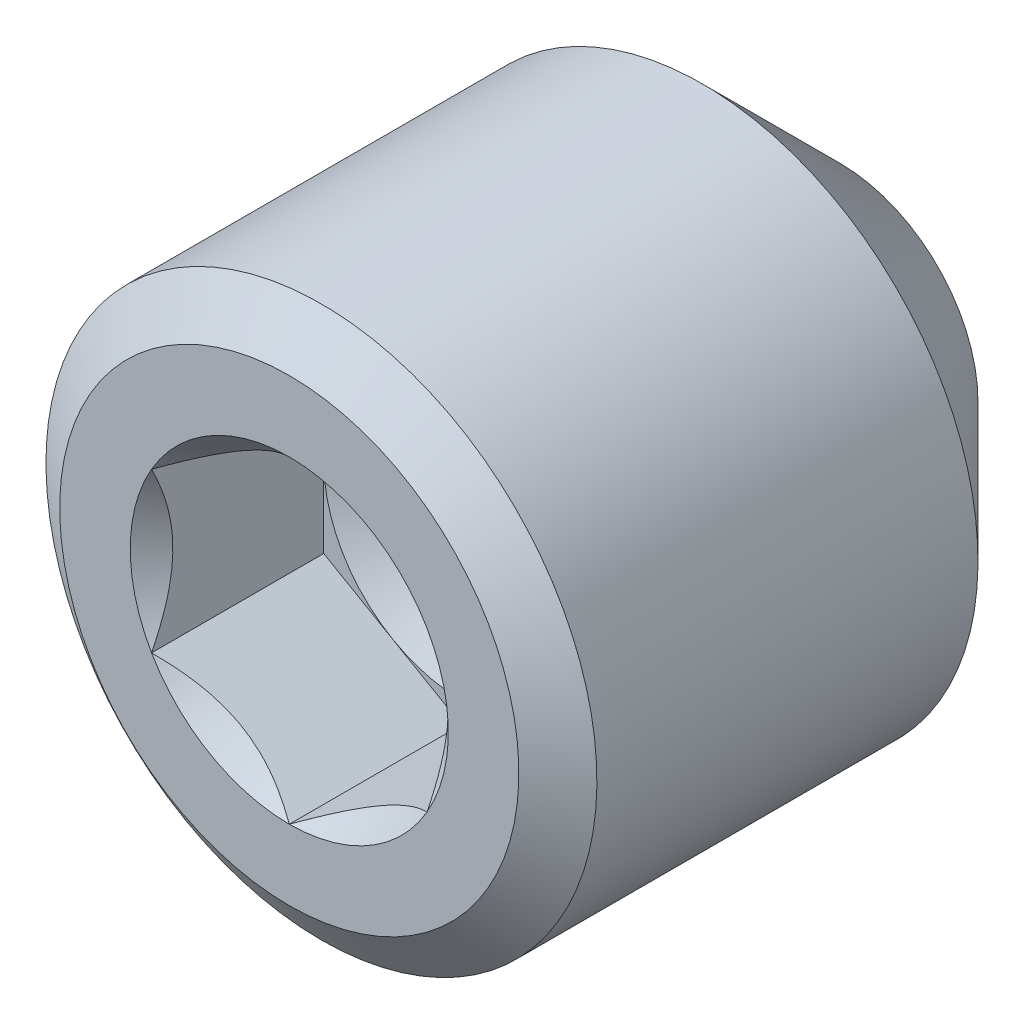
ISO-10303-21;
HEADER;
FILE_DESCRIPTION(('STEP AP214'),'2;1');
FILE_NAME('part.step','',(''),(''),'','','');
FILE_SCHEMA(('AUTOMOTIVE_DESIGN { 1 0 10303 214 1 1 1 1 }'));
ENDSEC;
DATA;
#1=APPLICATION_CONTEXT('core data for automotive mechanical design processes');
#2=APPLICATION_PROTOCOL_DEFINITION('international standard','automotive_design',2000,#1);
#3=PRODUCT_CONTEXT('',#1,'mechanical');
#4=PRODUCT('Part','Part','',(#3));
#5=PRODUCT_RELATED_PRODUCT_CATEGORY('part','',(#4));
#6=PRODUCT_DEFINITION_FORMATION('','',#4);
#7=PRODUCT_DEFINITION_CONTEXT('part definition',#1,'design');
#8=PRODUCT_DEFINITION('design','',#6,#7);
#9=PRODUCT_DEFINITION_SHAPE('','',#8);
#10=(LENGTH_UNIT() NAMED_UNIT(*) SI_UNIT(.MILLI.,.METRE.));
#11=(NAMED_UNIT(*) PLANE_ANGLE_UNIT() SI_UNIT($,.RADIAN.));
#12=(NAMED_UNIT(*) SI_UNIT($,.STERADIAN.) SOLID_ANGLE_UNIT());
#13=UNCERTAINTY_MEASURE_WITH_UNIT(LENGTH_MEASURE(1.E-05),#10,'distance_accuracy_value','');
#14=(GEOMETRIC_REPRESENTATION_CONTEXT(3) GLOBAL_UNCERTAINTY_ASSIGNED_CONTEXT((#13)) GLOBAL_UNIT_ASSIGNED_CONTEXT((#10,
#11,#12)) REPRESENTATION_CONTEXT('',''));
#15=CARTESIAN_POINT('',(0.,0.,0.));
#16=DIRECTION('',(0.,0.,1.));
#17=DIRECTION('',(1.,0.,0.));
#18=AXIS2_PLACEMENT_3D('',#15,#16,#17);
#19=CARTESIAN_POINT('',(-0.75,1.29903810567666,0.5625));
#20=DIRECTION('',(0.,0.,1.));
#21=DIRECTION('',(1.,0.,0.));
#22=AXIS2_PLACEMENT_3D('',#19,#20,#21);
#23=PLANE('',#22);
#24=CARTESIAN_POINT('',(0.,0.,0.5625));
#25=DIRECTION('',(0.,0.,1.));
#26=DIRECTION('',(1.,0.,0.));
#27=AXIS2_PLACEMENT_3D('',#24,#25,#26);
#28=CIRCLE('',#27,0.75);
#29=CARTESIAN_POINT('',(0.75,0.,0.5625));
#30=VERTEX_POINT('',#29);
#31=CARTESIAN_POINT('',(0.374999999999995,0.649519052838332,0.5625));
#32=VERTEX_POINT('',#31);
#33=EDGE_CURVE('E131',#30,#32,#28,.T.);
#34=ORIENTED_EDGE('',*,*,#33,.F.);
#35=DIRECTION('',(0.,1.,0.));
#36=VECTOR('',#35,1.);
#37=CARTESIAN_POINT('',(0.75,-0.433012701892219,0.5625));
#38=LINE('',#37,#36);
#39=CARTESIAN_POINT('',(0.75,0.433012701892219,0.5625));
#40=VERTEX_POINT('',#39);
#41=EDGE_CURVE('E160',#30,#40,#38,.T.);
#42=ORIENTED_EDGE('',*,*,#41,.T.);
#43=DIRECTION('',(-0.866025403784439,0.5,0.));
#44=VECTOR('',#43,1.);
#45=CARTESIAN_POINT('',(0.75,0.433012701892219,0.5625));
#46=LINE('',#45,#44);
#47=EDGE_CURVE('E154',#40,#32,#46,.T.);
#48=ORIENTED_EDGE('',*,*,#47,.T.);
#49=EDGE_LOOP('',(#34,#42,#48));
#50=FACE_BOUND('',#49,.T.);
#51=ADVANCED_FACE('F43',(#50),#23,.T.);
#52=CARTESIAN_POINT('',(-0.374999999999996,0.649519052838332,0.5625));
#53=VERTEX_POINT('',#52);
#54=EDGE_CURVE('E133',#32,#53,#28,.T.);
#55=ORIENTED_EDGE('',*,*,#54,.F.);
#56=CARTESIAN_POINT('',(0.,0.866025403784438,0.5625));
#57=VERTEX_POINT('',#56);
#58=EDGE_CURVE('E145',#32,#57,#46,.T.);
#59=ORIENTED_EDGE('',*,*,#58,.T.);
#60=DIRECTION('',(-0.866025403784438,-0.5,0.));
#61=VECTOR('',#60,1.);
#62=CARTESIAN_POINT('',(0.,0.866025403784438,0.5625));
#63=LINE('',#62,#61);
#64=EDGE_CURVE('E148',#57,#53,#63,.T.);
#65=ORIENTED_EDGE('',*,*,#64,.T.);
#66=EDGE_LOOP('',(#55,#59,#65));
#67=FACE_BOUND('',#66,.T.);
#68=ADVANCED_FACE('F144',(#67),#23,.T.);
#69=CARTESIAN_POINT('',(-0.75,0.,0.5625));
#70=VERTEX_POINT('',#69);
#71=EDGE_CURVE('E150',#53,#70,#28,.T.);
#72=ORIENTED_EDGE('',*,*,#71,.F.);
#73=CARTESIAN_POINT('',(-0.75,0.433012701892219,0.5625));
#74=VERTEX_POINT('',#73);
#75=EDGE_CURVE('E163',#53,#74,#63,.T.);
#76=ORIENTED_EDGE('',*,*,#75,.T.);
#77=DIRECTION('',(0.,-1.,0.));
#78=VECTOR('',#77,1.);
#79=CARTESIAN_POINT('',(-0.75,0.433012701892219,0.5625));
#80=LINE('',#79,#78);
#81=EDGE_CURVE('E176',#74,#70,#80,.T.);
#82=ORIENTED_EDGE('',*,*,#81,.T.);
#83=EDGE_LOOP('',(#72,#76,#82));
#84=FACE_BOUND('',#83,.T.);
#85=ADVANCED_FACE('F265',(#84),#23,.T.);
#86=CARTESIAN_POINT('',(-0.375000000000005,-0.649519052838327,0.5625));
#87=VERTEX_POINT('',#86);
#88=EDGE_CURVE('E292',#70,#87,#28,.T.);
#89=ORIENTED_EDGE('',*,*,#88,.F.);
#90=CARTESIAN_POINT('',(-0.75,-0.43301270189222,0.5625));
#91=VERTEX_POINT('',#90);
#92=EDGE_CURVE('E175',#70,#91,#80,.T.);
#93=ORIENTED_EDGE('',*,*,#92,.T.);
#94=DIRECTION('',(0.866025403784439,-0.5,0.));
#95=VECTOR('',#94,1.);
#96=CARTESIAN_POINT('',(-0.75,-0.43301270189222,0.5625));
#97=LINE('',#96,#95);
#98=EDGE_CURVE('E181',#91,#87,#97,.T.);
#99=ORIENTED_EDGE('',*,*,#98,.T.);
#100=EDGE_LOOP('',(#89,#93,#99));
#101=FACE_BOUND('',#100,.T.);
#102=ADVANCED_FACE('F280',(#101),#23,.T.);
#103=CARTESIAN_POINT('',(0.375000000000005,-0.649519052838326,0.5625));
#104=VERTEX_POINT('',#103);
#105=EDGE_CURVE('E65',#87,#104,#28,.T.);
#106=ORIENTED_EDGE('',*,*,#105,.F.);
#107=CARTESIAN_POINT('',(0.,-0.866025403784439,0.5625));
#108=VERTEX_POINT('',#107);
#109=EDGE_CURVE('E180',#87,#108,#97,.T.);
#110=ORIENTED_EDGE('',*,*,#109,.T.);
#111=DIRECTION('',(0.866025403784439,0.5,0.));
#112=VECTOR('',#111,1.);
#113=CARTESIAN_POINT('',(0.,-0.866025403784439,0.5625));
#114=LINE('',#113,#112);
#115=EDGE_CURVE('E186',#108,#104,#114,.T.);
#116=ORIENTED_EDGE('',*,*,#115,.T.);
#117=EDGE_LOOP('',(#106,#110,#116));
#118=FACE_BOUND('',#117,.T.);
#119=ADVANCED_FACE('F270',(#118),#23,.T.);
#120=CARTESIAN_POINT('',(0.,0.,1.5));
#121=DIRECTION('',(0.,0.,-1.));
#122=DIRECTION('',(0.,1.,0.));
#123=AXIS2_PLACEMENT_3D('',#120,#121,#122);
#124=PLANE('',#123);
#125=CARTESIAN_POINT('',(0.,0.,1.5));
#126=DIRECTION('',(0.,0.,1.));
#127=DIRECTION('',(1.,0.,0.));
#128=AXIS2_PLACEMENT_3D('',#125,#126,#127);
#129=CIRCLE('',#128,0.866025403784439);
#130=CARTESIAN_POINT('',(0.,0.866025403784438,1.5));
#131=VERTEX_POINT('',#130);
#132=CARTESIAN_POINT('',(-0.749999999999999,0.43301270189222,1.5));
#133=VERTEX_POINT('',#132);
#134=EDGE_CURVE('E321',#131,#133,#129,.T.);
#135=ORIENTED_EDGE('',*,*,#134,.F.);
#136=CARTESIAN_POINT('',(0.75,0.433012701892217,1.5));
#137=VERTEX_POINT('',#136);
#138=EDGE_CURVE('E322',#137,#131,#129,.T.);
#139=ORIENTED_EDGE('',*,*,#138,.F.);
#140=CARTESIAN_POINT('',(0.750000000000001,-0.433012701892219,1.5));
#141=VERTEX_POINT('',#140);
#142=EDGE_CURVE('E72',#141,#137,#129,.T.);
#143=ORIENTED_EDGE('',*,*,#142,.F.);
#144=CARTESIAN_POINT('',(0.,-0.86602540378444,1.5));
#145=VERTEX_POINT('',#144);
#146=EDGE_CURVE('E314',#145,#141,#129,.T.);
#147=ORIENTED_EDGE('',*,*,#146,.F.);
#148=CARTESIAN_POINT('',(-0.75,-0.433012701892221,1.5));
#149=VERTEX_POINT('',#148);
#150=EDGE_CURVE('E311',#149,#145,#129,.T.);
#151=ORIENTED_EDGE('',*,*,#150,.F.);
#152=EDGE_CURVE('E313',#133,#149,#129,.T.);
#153=ORIENTED_EDGE('',*,*,#152,.F.);
#154=EDGE_LOOP('',(#135,#139,#143,#147,#151,#153));
#155=FACE_BOUND('',#154,.T.);
#156=CARTESIAN_POINT('',(0.,0.,1.5));
#157=DIRECTION('',(0.,0.,1.));
#158=DIRECTION('',(0.,-1.,0.));
#159=AXIS2_PLACEMENT_3D('',#156,#157,#158);
#160=CIRCLE('',#159,1.25);
#161=CARTESIAN_POINT('',(0.,-1.25,1.5));
#162=VERTEX_POINT('',#161);
#163=EDGE_CURVE('E58',#162,#162,#160,.T.);
#164=ORIENTED_EDGE('',*,*,#163,.T.);
#165=EDGE_LOOP('',(#164));
#166=FACE_BOUND('',#165,.T.);
#167=ADVANCED_FACE('F45',(#155,#166),#124,.F.);
#168=CARTESIAN_POINT('',(0.,0.,1.32494811544757));
#169=DIRECTION('',(0.,0.,-1.));
#170=DIRECTION('',(0.,1.,0.));
#171=AXIS2_PLACEMENT_3D('',#168,#169,#170);
#172=CONICAL_SURFACE('',#171,1.5,0.959931088596878);
#173=ORIENTED_EDGE('',*,*,#163,.F.);
#174=EDGE_LOOP('',(#173));
#175=FACE_BOUND('',#174,.T.);
#176=CARTESIAN_POINT('',(0.,0.,1.32494811544757));
#177=DIRECTION('',(0.,0.,1.));
#178=DIRECTION('',(0.,-1.,0.));
#179=AXIS2_PLACEMENT_3D('',#176,#177,#178);
#180=CIRCLE('',#179,1.5);
#181=CARTESIAN_POINT('',(0.,-1.5,1.32494811544757));
#182=VERTEX_POINT('',#181);
#183=EDGE_CURVE('E223',#182,#182,#180,.T.);
#184=ORIENTED_EDGE('',*,*,#183,.T.);
#185=EDGE_LOOP('',(#184));
#186=FACE_BOUND('',#185,.T.);
#187=ADVANCED_FACE('F231',(#175,#186),#172,.T.);
#188=CARTESIAN_POINT('',(0.,0.,-1.04935453572933));
#189=DIRECTION('',(0.,0.,1.));
#190=DIRECTION('',(0.,-1.,0.));
#191=AXIS2_PLACEMENT_3D('',#188,#189,#190);
#192=CYLINDRICAL_SURFACE('',#191,1.5);
#193=ORIENTED_EDGE('',*,*,#183,.F.);
#194=EDGE_LOOP('',(#193));
#195=FACE_BOUND('',#194,.T.);
#196=CARTESIAN_POINT('',(0.,0.,-0.750000000000008));
#197=DIRECTION('',(0.,0.,1.));
#198=DIRECTION('',(0.,-1.,0.));
#199=AXIS2_PLACEMENT_3D('',#196,#197,#198);
#200=CIRCLE('',#199,1.5);
#201=CARTESIAN_POINT('',(0.,-1.5,-0.750000000000008));
#202=VERTEX_POINT('',#201);
#203=EDGE_CURVE('E219',#202,#202,#200,.T.);
#204=ORIENTED_EDGE('',*,*,#203,.T.);
#205=EDGE_LOOP('',(#204));
#206=FACE_BOUND('',#205,.T.);
#207=ADVANCED_FACE('F234',(#195,#206),#192,.T.);
#208=CARTESIAN_POINT('',(0.,0.,-1.5));
#209=DIRECTION('',(0.,0.,1.));
#210=DIRECTION('',(0.,-1.,0.));
#211=AXIS2_PLACEMENT_3D('',#208,#209,#210);
#212=CONICAL_SURFACE('',#211,0.75,0.785398163397454);
#213=ORIENTED_EDGE('',*,*,#203,.F.);
#214=EDGE_LOOP('',(#213));
#215=FACE_BOUND('',#214,.T.);
#216=CARTESIAN_POINT('',(0.,0.,-1.5));
#217=DIRECTION('',(0.,0.,1.));
#218=DIRECTION('',(0.,-1.,0.));
#219=AXIS2_PLACEMENT_3D('',#216,#217,#218);
#220=CIRCLE('',#219,0.75);
#221=CARTESIAN_POINT('',(0.,-0.75,-1.5));
#222=VERTEX_POINT('',#221);
#223=EDGE_CURVE('E197',#222,#222,#220,.T.);
#224=ORIENTED_EDGE('',*,*,#223,.T.);
#225=EDGE_LOOP('',(#224));
#226=FACE_BOUND('',#225,.T.);
#227=ADVANCED_FACE('F239',(#215,#226),#212,.T.);
#228=CARTESIAN_POINT('',(0.,0.,-1.04935453572933));
#229=DIRECTION('',(0.,0.,-1.));
#230=DIRECTION('',(0.,1.,0.));
#231=AXIS2_PLACEMENT_3D('',#228,#229,#230);
#232=CONICAL_SURFACE('',#231,0.,1.02974425867666);
#233=ORIENTED_EDGE('',*,*,#223,.F.);
#234=EDGE_LOOP('',(#233));
#235=FACE_BOUND('',#234,.T.);
#236=CARTESIAN_POINT('',(0.,0.,-1.04935453572933));
#237=VERTEX_POINT('',#236);
#238=VERTEX_LOOP('',#237);
#239=FACE_BOUND('',#238,.T.);
#240=ADVANCED_FACE('F245',(#235,#239),#232,.F.);
#241=CARTESIAN_POINT('',(0.,0.,1.5));
#242=DIRECTION('',(0.,0.,1.));
#243=DIRECTION('',(1.,0.,0.));
#244=AXIS2_PLACEMENT_3D('',#241,#242,#243);
#245=CONICAL_SURFACE('',#244,0.866025403784439,0.78539816339745);
#246=ORIENTED_EDGE('',*,*,#134,.T.);
#247=CARTESIAN_POINT('',(0.00019999999999911,0.866140873838276,1.50011549314477));
#248=CARTESIAN_POINT('',(-0.0255899625576824,0.851251032013209,1.48523411046393));
#249=CARTESIAN_POINT('',(-0.0518112021286601,0.836112192288419,1.47122626560696));
#250=CARTESIAN_POINT('',(-0.105279708235707,0.805242135894348,1.44557752468226));
#251=CARTESIAN_POINT('',(-0.132532067460574,0.789507978959819,1.43395091170567));
#252=CARTESIAN_POINT('',(-0.187485350381354,0.757780686272653,1.41403404577224));
#253=CARTESIAN_POINT('',(-0.215172256695511,0.741795643459147,1.40569369408137));
#254=CARTESIAN_POINT('',(-0.271155595130854,0.709473647943367,1.39284274196143));
#255=CARTESIAN_POINT('',(-0.299450314843646,0.693137683900541,1.38832254058884));
#256=CARTESIAN_POINT('',(-0.348210289268845,0.664986099540474,1.38424583309744));
#257=CARTESIAN_POINT('',(-0.368612065655574,0.653207128451649,1.38364279661408));
#258=CARTESIAN_POINT('',(-0.409376134696362,0.629671982217686,1.38465450601553));
#259=CARTESIAN_POINT('',(-0.429738417651457,0.617915812672246,1.38626974099004));
#260=CARTESIAN_POINT('',(-0.490534543086826,0.58281515328645,1.39433614697304));
#261=CARTESIAN_POINT('',(-0.530665854996101,0.559645329552697,1.40400893582772));
#262=CARTESIAN_POINT('',(-0.601110400354027,0.518974152327357,1.42735631797232));
#263=CARTESIAN_POINT('',(-0.631753572009088,0.501282308923484,1.43980855807225));
#264=CARTESIAN_POINT('',(-0.691839345804791,0.466591771248068,1.46785961023086));
#265=CARTESIAN_POINT('',(-0.721285488381591,0.449591032904756,1.48344818590375));
#266=CARTESIAN_POINT('',(-0.7502,0.432897231838381,1.50011549314477));
#267=B_SPLINE_CURVE_WITH_KNOTS('',3,(#247,#248,#249,#250,#251,#252,#253,#254,#255,#256,#257,
#258,#259,#260,#261,#262,#263,#264,#265,#266),.UNSPECIFIED.,.F.,.F.,(4,2,2,2,2,2,2,2,2,4),(0.,
0.0999419466095597,0.200466857654446,0.299393763705718,0.398071297300231,0.468665775681749,
0.53927582139884,0.680536257244568,0.792918418368074,0.904939568716031),.UNSPECIFIED.);
#268=EDGE_CURVE('E11',#131,#133,#267,.T.);
#269=ORIENTED_EDGE('',*,*,#268,.F.);
#270=EDGE_LOOP('',(#246,#269));
#271=FACE_BOUND('',#270,.T.);
#272=ADVANCED_FACE('F251',(#271),#245,.F.);
#273=ORIENTED_EDGE('',*,*,#152,.T.);
#274=CARTESIAN_POINT('',(-0.75,-0.863604064848461,1.77778925813539));
#275=CARTESIAN_POINT('',(-0.75,-0.842575879734331,1.76191493200841));
#276=CARTESIAN_POINT('',(-0.75,-0.821430496291559,1.746196265183));
#277=CARTESIAN_POINT('',(-0.75,-0.778857857419018,1.71513452062663));
#278=CARTESIAN_POINT('',(-0.75,-0.757430533042235,1.69979153749355));
#279=CARTESIAN_POINT('',(-0.75,-0.692340710712935,1.65420358029366));
#280=CARTESIAN_POINT('',(-0.75,-0.648190081053412,1.62464409174343));
#281=CARTESIAN_POINT('',(-0.75,-0.555607181501749,1.5666155826928));
#282=CARTESIAN_POINT('',(-0.75,-0.507074363017995,1.53830510936579));
#283=CARTESIAN_POINT('',(-0.75,-0.407587529772337,1.48651811176889));
#284=CARTESIAN_POINT('',(-0.75,-0.35664241954847,1.46302529153185));
#285=CARTESIAN_POINT('',(-0.75,-0.280165468820771,1.43428689950068));
#286=CARTESIAN_POINT('',(-0.75,-0.255770023930572,1.42603927481305));
#287=CARTESIAN_POINT('',(-0.75,-0.206403277885132,1.41149717542019));
#288=CARTESIAN_POINT('',(-0.75,-0.181431937185907,1.40520283526912));
#289=CARTESIAN_POINT('',(-0.75,-0.106699879404925,1.3899931738806));
#290=CARTESIAN_POINT('',(-0.75,-0.0561907171762178,1.38437718471289));
#291=CARTESIAN_POINT('',(-0.75,0.0430767231749056,1.38362825645435));
#292=CARTESIAN_POINT('',(-0.75,0.0918322434166278,1.38812345140561));
#293=CARTESIAN_POINT('',(-0.75,0.164112195698293,1.40133730744598));
#294=CARTESIAN_POINT('',(-0.75,0.188278676879436,1.40690144638208));
#295=CARTESIAN_POINT('',(-0.75,0.23609448012033,1.41992316614873));
#296=CARTESIAN_POINT('',(-0.75,0.25974384527304,1.42738058854766));
#297=CARTESIAN_POINT('',(-0.75,0.334198278463819,1.45366646946609));
#298=CARTESIAN_POINT('',(-0.75,0.383940060445494,1.47549033804844));
#299=CARTESIAN_POINT('',(-0.75,0.481089225076666,1.52401180410059));
#300=CARTESIAN_POINT('',(-0.75,0.528487417973016,1.55072691131035));
#301=CARTESIAN_POINT('',(-0.75,0.619071540465251,1.60584285115078));
#302=CARTESIAN_POINT('',(-0.75,0.662349745300239,1.63409394545219));
#303=CARTESIAN_POINT('',(-0.75,0.726111623216224,1.6777671470975));
#304=CARTESIAN_POINT('',(-0.75,0.74709041925528,1.6924788605167));
#305=CARTESIAN_POINT('',(-0.75,0.78876134150186,1.7222913841024));
#306=CARTESIAN_POINT('',(-0.75,0.809453544535619,1.73739208676303));
#307=CARTESIAN_POINT('',(-0.75,0.830026390097469,1.75265408930473));
#308=B_SPLINE_CURVE_WITH_KNOTS('',3,(#274,#275,#276,#277,#278,#279,#280,#281,#282,#283,#284,
#285,#286,#287,#288,#289,#290,#291,#292,#293,#294,#295,#296,#297,#298,#299,#300,#301,#302,#303,
#304,#305,#306,#307),.UNSPECIFIED.,.F.,.F.,(4,2,2,2,2,2,2,2,2,2,2,2,2,2,2,2,4),(0.,
0.0790398443124675,0.158099390497592,0.3174252086741,0.485845155681375,0.653685658303955,
0.730869805636063,0.808059268704006,0.959469653380777,1.10540290447489,1.17973203111653,
1.25405493988071,1.41653726506053,1.57961304287543,1.73458511695815,1.81145152932466,
1.8882969211581),.UNSPECIFIED.);
#309=EDGE_CURVE('E305',#133,#149,#308,.F.);
#310=ORIENTED_EDGE('',*,*,#309,.F.);
#311=EDGE_LOOP('',(#273,#310));
#312=FACE_BOUND('',#311,.T.);
#313=ADVANCED_FACE('F256',(#312),#245,.F.);
#314=ORIENTED_EDGE('',*,*,#150,.T.);
#315=CARTESIAN_POINT('',(-0.7502,-0.432897231838382,1.50011549314477));
#316=CARTESIAN_POINT('',(-0.724410037442319,-0.44778707366345,1.48523411046392));
#317=CARTESIAN_POINT('',(-0.698188797871341,-0.462925913388239,1.47122626560696));
#318=CARTESIAN_POINT('',(-0.644720291764294,-0.49379596978231,1.44557752468226));
#319=CARTESIAN_POINT('',(-0.617467932539427,-0.509530126716839,1.43395091170567));
#320=CARTESIAN_POINT('',(-0.562514649618647,-0.541257419404005,1.41403404577224));
#321=CARTESIAN_POINT('',(-0.53482774330449,-0.557242462217512,1.40569369408137));
#322=CARTESIAN_POINT('',(-0.478844404869146,-0.589564457733291,1.39284274196142));
#323=CARTESIAN_POINT('',(-0.450549685156354,-0.605900421776117,1.38832254058884));
#324=CARTESIAN_POINT('',(-0.401789710731156,-0.634052006136184,1.38424583309743));
#325=CARTESIAN_POINT('',(-0.381387934344426,-0.645830977225009,1.38364279661408));
#326=CARTESIAN_POINT('',(-0.340623865303639,-0.669366123458972,1.38465450601552));
#327=CARTESIAN_POINT('',(-0.320261582348544,-0.681122293004411,1.38626974099003));
#328=CARTESIAN_POINT('',(-0.259465456913175,-0.716222952390208,1.39433614697304));
#329=CARTESIAN_POINT('',(-0.2193341450039,-0.73939277612396,1.40400893582772));
#330=CARTESIAN_POINT('',(-0.148889599645974,-0.7800639533493,1.42735631797231));
#331=CARTESIAN_POINT('',(-0.118246427990913,-0.797755796753173,1.43980855807225));
#332=CARTESIAN_POINT('',(-0.0581606541952098,-0.83244633442859,1.46785961023086));
#333=CARTESIAN_POINT('',(-0.0287145116184089,-0.849447072771902,1.48344818590375));
#334=CARTESIAN_POINT('',(0.000200000000000292,-0.866140873838277,1.50011549314477));
#335=B_SPLINE_CURVE_WITH_KNOTS('',3,(#315,#316,#317,#318,#319,#320,#321,#322,#323,#324,#325,
#326,#327,#328,#329,#330,#331,#332,#333,#334),.UNSPECIFIED.,.F.,.F.,(4,2,2,2,2,2,2,2,2,4),(0.,
0.09994194660956,0.200466857654447,0.299393763705718,0.398071297300232,0.468665775681749,
0.539275821398841,0.680536257244567,0.792918418368075,0.904939568716032),.UNSPECIFIED.);
#336=EDGE_CURVE('E308',#149,#145,#335,.T.);
#337=ORIENTED_EDGE('',*,*,#336,.F.);
#338=EDGE_LOOP('',(#314,#337));
#339=FACE_BOUND('',#338,.T.);
#340=ADVANCED_FACE('F477',(#339),#245,.F.);
#341=ORIENTED_EDGE('',*,*,#146,.T.);
#342=CARTESIAN_POINT('',(-0.000199999999999794,-0.866140873838277,1.50011549314477));
#343=CARTESIAN_POINT('',(0.0255899625576816,-0.851251032013209,1.48523411046392));
#344=CARTESIAN_POINT('',(0.0518112021286594,-0.836112192288419,1.47122626560696));
#345=CARTESIAN_POINT('',(0.105279708235707,-0.805242135894348,1.44557752468226));
#346=CARTESIAN_POINT('',(0.132532067460573,-0.789507978959819,1.43395091170566));
#347=CARTESIAN_POINT('',(0.187485350381353,-0.757780686272653,1.41403404577224));
#348=CARTESIAN_POINT('',(0.21517225669551,-0.741795643459147,1.40569369408137));
#349=CARTESIAN_POINT('',(0.271155595130853,-0.709473647943368,1.39284274196142));
#350=CARTESIAN_POINT('',(0.299450314843645,-0.693137683900542,1.38832254058884));
#351=CARTESIAN_POINT('',(0.348210289268844,-0.664986099540475,1.38424583309743));
#352=CARTESIAN_POINT('',(0.368612065655573,-0.65320712845165,1.38364279661408));
#353=CARTESIAN_POINT('',(0.40937613469636,-0.629671982217687,1.38465450601552));
#354=CARTESIAN_POINT('',(0.429738417651455,-0.617915812672247,1.38626974099003));
#355=CARTESIAN_POINT('',(0.490534543086824,-0.582815153286451,1.39433614697304));
#356=CARTESIAN_POINT('',(0.530665854996099,-0.559645329552698,1.40400893582772));
#357=CARTESIAN_POINT('',(0.601110400354026,-0.518974152327358,1.42735631797231));
#358=CARTESIAN_POINT('',(0.631753572009087,-0.501282308923485,1.43980855807225));
#359=CARTESIAN_POINT('',(0.69183934580479,-0.466591771248069,1.46785961023086));
#360=CARTESIAN_POINT('',(0.721285488381591,-0.449591032904757,1.48344818590375));
#361=CARTESIAN_POINT('',(0.7502,-0.432897231838382,1.50011549314477));
#362=B_SPLINE_CURVE_WITH_KNOTS('',3,(#342,#343,#344,#345,#346,#347,#348,#349,#350,#351,#352,
#353,#354,#355,#356,#357,#358,#359,#360,#361),.UNSPECIFIED.,.F.,.F.,(4,2,2,2,2,2,2,2,2,4),(0.,
0.0999419466095597,0.200466857654446,0.299393763705717,0.39807129730023,0.468665775681748,
0.539275821398839,0.680536257244566,0.792918418368074,0.904939568716032),.UNSPECIFIED.);
#363=EDGE_CURVE('E366',#145,#141,#362,.T.);
#364=ORIENTED_EDGE('',*,*,#363,.F.);
#365=EDGE_LOOP('',(#341,#364));
#366=FACE_BOUND('',#365,.T.);
#367=ADVANCED_FACE('F469',(#366),#245,.F.);
#368=ORIENTED_EDGE('',*,*,#142,.T.);
#369=CARTESIAN_POINT('',(0.75,-0.863604064974111,1.77778925823026));
#370=CARTESIAN_POINT('',(0.75,-0.842575879856456,1.76191493209962));
#371=CARTESIAN_POINT('',(0.75,-0.821430496410148,1.74619626527057));
#372=CARTESIAN_POINT('',(0.75,-0.778857857530497,1.71513452070692));
#373=CARTESIAN_POINT('',(0.75,-0.757430533150142,1.69979153757022));
#374=CARTESIAN_POINT('',(0.75,-0.692340710809909,1.65420358035938));
#375=CARTESIAN_POINT('',(0.75,-0.648190081142952,1.62464409180187));
#376=CARTESIAN_POINT('',(0.75,-0.555607181575073,1.56661558273629));
#377=CARTESIAN_POINT('',(0.75,-0.507074363082497,1.53830510940166));
#378=CARTESIAN_POINT('',(0.75,-0.407587529818441,1.48651811179061));
#379=CARTESIAN_POINT('',(0.75,-0.356642419585008,1.46302529154705));
#380=CARTESIAN_POINT('',(0.75,-0.280165468850111,1.43428689951103));
#381=CARTESIAN_POINT('',(0.75,-0.255770023962927,1.4260392748236));
#382=CARTESIAN_POINT('',(0.75,-0.206403277923611,1.41149717543051));
#383=CARTESIAN_POINT('',(0.75,-0.181431937227495,1.40520283527902));
#384=CARTESIAN_POINT('',(0.75,-0.106699879455629,1.38999317388815));
#385=CARTESIAN_POINT('',(0.75,-0.056190717232978,1.38437718471751));
#386=CARTESIAN_POINT('',(0.75,0.0430767231074186,1.38362825645083));
#387=CARTESIAN_POINT('',(0.75,0.091832243344437,1.38812345139702));
#388=CARTESIAN_POINT('',(0.75,0.164112195619625,1.40133730742922));
#389=CARTESIAN_POINT('',(0.75,0.188278676798616,1.40690144636243));
#390=CARTESIAN_POINT('',(0.75,0.236094480035412,1.41992316612325));
#391=CARTESIAN_POINT('',(0.75,0.259743845186175,1.42738058851924));
#392=CARTESIAN_POINT('',(0.75,0.334198278358036,1.45366646942379));
#393=CARTESIAN_POINT('',(0.75,0.383940060323693,1.47549033799338));
#394=CARTESIAN_POINT('',(0.75,0.481089224924054,1.52401180401857));
#395=CARTESIAN_POINT('',(0.75,0.528487417805622,1.55072691121415));
#396=CARTESIAN_POINT('',(0.75,0.619071540271278,1.60584285102742));
#397=CARTESIAN_POINT('',(0.75,0.662349745094376,1.63409394531598));
#398=CARTESIAN_POINT('',(0.75,0.726111622992782,1.6777671469421));
#399=CARTESIAN_POINT('',(0.75,0.747090419026062,1.69247886035495));
#400=CARTESIAN_POINT('',(0.75,0.788761341261128,1.72229138392795));
#401=CARTESIAN_POINT('',(0.75,0.809453544289149,1.73739208658224));
#402=CARTESIAN_POINT('',(0.75,0.830026389845271,1.7526540891176));
#403=B_SPLINE_CURVE_WITH_KNOTS('',3,(#369,#370,#371,#372,#373,#374,#375,#376,#377,#378,#379,
#380,#381,#382,#383,#384,#385,#386,#387,#388,#389,#390,#391,#392,#393,#394,#395,#396,#397,#398,
#399,#400,#401,#402),.UNSPECIFIED.,.F.,.F.,(4,2,2,2,2,2,2,2,2,2,2,2,2,2,2,2,4),(0.,
0.0790398443275125,0.158099390527687,0.317425208734854,0.485845155776512,0.653685658433147,
0.730869805756539,0.80805926881578,0.959469653475932,1.10540290455479,1.1797320311882,
1.25405493994416,1.41653726506483,1.57961304282019,1.73458511685198,1.81145152919337,
1.88829692100168),.UNSPECIFIED.);
#404=EDGE_CURVE('E359',#141,#137,#403,.T.);
#405=ORIENTED_EDGE('',*,*,#404,.F.);
#406=EDGE_LOOP('',(#368,#405));
#407=FACE_BOUND('',#406,.T.);
#408=ADVANCED_FACE('F277',(#407),#245,.F.);
#409=ORIENTED_EDGE('',*,*,#138,.T.);
#410=CARTESIAN_POINT('',(0.7502,0.432897231838381,1.50011549314477));
#411=CARTESIAN_POINT('',(0.724410037442319,0.447787073663449,1.48523411046392));
#412=CARTESIAN_POINT('',(0.698188797871341,0.462925913388239,1.47122626560696));
#413=CARTESIAN_POINT('',(0.644720291764294,0.493795969782309,1.44557752468226));
#414=CARTESIAN_POINT('',(0.617467932539427,0.509530126716838,1.43395091170567));
#415=CARTESIAN_POINT('',(0.562514649618647,0.541257419404004,1.41403404577224));
#416=CARTESIAN_POINT('',(0.534827743304491,0.557242462217511,1.40569369408137));
#417=CARTESIAN_POINT('',(0.478844404869147,0.58956445773329,1.39284274196143));
#418=CARTESIAN_POINT('',(0.450549685156355,0.605900421776115,1.38832254058884));
#419=CARTESIAN_POINT('',(0.401789710731157,0.634052006136183,1.38424583309744));
#420=CARTESIAN_POINT('',(0.381387934344428,0.645830977225008,1.38364279661408));
#421=CARTESIAN_POINT('',(0.34062386530364,0.669366123458971,1.38465450601553));
#422=CARTESIAN_POINT('',(0.320261582348545,0.68112229300441,1.38626974099003));
#423=CARTESIAN_POINT('',(0.259465456913176,0.716222952390207,1.39433614697304));
#424=CARTESIAN_POINT('',(0.219334145003901,0.73939277612396,1.40400893582772));
#425=CARTESIAN_POINT('',(0.148889599645974,0.780063953349299,1.42735631797232));
#426=CARTESIAN_POINT('',(0.118246427990913,0.797755796753173,1.43980855807225));
#427=CARTESIAN_POINT('',(0.0581606541952096,0.832446334428589,1.46785961023086));
#428=CARTESIAN_POINT('',(0.0287145116184085,0.849447072771901,1.48344818590375));
#429=CARTESIAN_POINT('',(-0.000200000000000895,0.866140873838276,1.50011549314477));
#430=B_SPLINE_CURVE_WITH_KNOTS('',3,(#410,#411,#412,#413,#414,#415,#416,#417,#418,#419,#420,
#421,#422,#423,#424,#425,#426,#427,#428,#429),.UNSPECIFIED.,.F.,.F.,(4,2,2,2,2,2,2,2,2,4),(0.,
0.0999419466095595,0.200466857654446,0.299393763705717,0.39807129730023,0.468665775681748,
0.539275821398839,0.680536257244566,0.792918418368074,0.904939568716033),.UNSPECIFIED.);
#431=EDGE_CURVE('E158',#137,#131,#430,.T.);
#432=ORIENTED_EDGE('',*,*,#431,.F.);
#433=EDGE_LOOP('',(#409,#432));
#434=FACE_BOUND('',#433,.T.);
#435=ADVANCED_FACE('F258',(#434),#245,.F.);
#436=EDGE_CURVE('E135',#104,#30,#28,.T.);
#437=ORIENTED_EDGE('',*,*,#436,.F.);
#438=CARTESIAN_POINT('',(0.75,-0.433012701892219,0.5625));
#439=VERTEX_POINT('',#438);
#440=EDGE_CURVE('E185',#104,#439,#114,.T.);
#441=ORIENTED_EDGE('',*,*,#440,.T.);
#442=EDGE_CURVE('E190',#439,#30,#38,.T.);
#443=ORIENTED_EDGE('',*,*,#442,.T.);
#444=EDGE_LOOP('',(#437,#441,#443));
#445=FACE_BOUND('',#444,.T.);
#446=ADVANCED_FACE('F261',(#445),#23,.T.);
#447=CARTESIAN_POINT('',(0.,0.866025403784438,0.5625));
#448=DIRECTION('',(-0.5,0.866025403784438,0.));
#449=DIRECTION('',(-0.866025403784438,-0.5,0.));
#450=AXIS2_PLACEMENT_3D('',#447,#448,#449);
#451=PLANE('',#450);
#452=DIRECTION('',(0.,0.,1.));
#453=VECTOR('',#452,1.);
#454=CARTESIAN_POINT('',(0.,0.866025403784438,0.5625));
#455=LINE('',#454,#453);
#456=EDGE_CURVE('E156',#57,#131,#455,.T.);
#457=ORIENTED_EDGE('',*,*,#456,.T.);
#458=ORIENTED_EDGE('',*,*,#268,.T.);
#459=DIRECTION('',(0.,0.,1.));
#460=VECTOR('',#459,1.);
#461=CARTESIAN_POINT('',(-0.75,0.433012701892219,0.5625));
#462=LINE('',#461,#460);
#463=EDGE_CURVE('E210',#74,#133,#462,.T.);
#464=ORIENTED_EDGE('',*,*,#463,.F.);
#465=ORIENTED_EDGE('',*,*,#75,.F.);
#466=ORIENTED_EDGE('',*,*,#64,.F.);
#467=EDGE_LOOP('',(#457,#458,#464,#465,#466));
#468=FACE_BOUND('',#467,.T.);
#469=ADVANCED_FACE('F268',(#468),#451,.F.);
#470=CARTESIAN_POINT('',(-0.75,0.433012701892219,0.5625));
#471=DIRECTION('',(-1.,0.,0.));
#472=DIRECTION('',(0.,-1.,0.));
#473=AXIS2_PLACEMENT_3D('',#470,#471,#472);
#474=PLANE('',#473);
#475=ORIENTED_EDGE('',*,*,#463,.T.);
#476=ORIENTED_EDGE('',*,*,#309,.T.);
#477=DIRECTION('',(0.,0.,1.));
#478=VECTOR('',#477,1.);
#479=CARTESIAN_POINT('',(-0.75,-0.43301270189222,0.5625));
#480=LINE('',#479,#478);
#481=EDGE_CURVE('E206',#91,#149,#480,.T.);
#482=ORIENTED_EDGE('',*,*,#481,.F.);
#483=ORIENTED_EDGE('',*,*,#92,.F.);
#484=ORIENTED_EDGE('',*,*,#81,.F.);
#485=EDGE_LOOP('',(#475,#476,#482,#483,#484));
#486=FACE_BOUND('',#485,.T.);
#487=ADVANCED_FACE('F275',(#486),#474,.F.);
#488=CARTESIAN_POINT('',(-0.75,-0.43301270189222,0.5625));
#489=DIRECTION('',(-0.5,-0.866025403784439,0.));
#490=DIRECTION('',(0.866025403784439,-0.5,0.));
#491=AXIS2_PLACEMENT_3D('',#488,#489,#490);
#492=PLANE('',#491);
#493=ORIENTED_EDGE('',*,*,#481,.T.);
#494=ORIENTED_EDGE('',*,*,#336,.T.);
#495=DIRECTION('',(0.,0.,1.));
#496=VECTOR('',#495,1.);
#497=CARTESIAN_POINT('',(0.,-0.866025403784439,0.5625));
#498=LINE('',#497,#496);
#499=EDGE_CURVE('E202',#108,#145,#498,.T.);
#500=ORIENTED_EDGE('',*,*,#499,.F.);
#501=ORIENTED_EDGE('',*,*,#109,.F.);
#502=ORIENTED_EDGE('',*,*,#98,.F.);
#503=EDGE_LOOP('',(#493,#494,#500,#501,#502));
#504=FACE_BOUND('',#503,.T.);
#505=ADVANCED_FACE('F295',(#504),#492,.F.);
#506=CARTESIAN_POINT('',(0.,-0.866025403784439,0.5625));
#507=DIRECTION('',(0.5,-0.866025403784439,0.));
#508=DIRECTION('',(0.866025403784439,0.5,0.));
#509=AXIS2_PLACEMENT_3D('',#506,#507,#508);
#510=PLANE('',#509);
#511=ORIENTED_EDGE('',*,*,#499,.T.);
#512=ORIENTED_EDGE('',*,*,#363,.T.);
#513=DIRECTION('',(0.,0.,1.));
#514=VECTOR('',#513,1.);
#515=CARTESIAN_POINT('',(0.75,-0.433012701892219,0.5625));
#516=LINE('',#515,#514);
#517=EDGE_CURVE('E198',#439,#141,#516,.T.);
#518=ORIENTED_EDGE('',*,*,#517,.F.);
#519=ORIENTED_EDGE('',*,*,#440,.F.);
#520=ORIENTED_EDGE('',*,*,#115,.F.);
#521=EDGE_LOOP('',(#511,#512,#518,#519,#520));
#522=FACE_BOUND('',#521,.T.);
#523=ADVANCED_FACE('F351',(#522),#510,.F.);
#524=CARTESIAN_POINT('',(0.75,-0.433012701892219,0.5625));
#525=DIRECTION('',(1.,0.,0.));
#526=DIRECTION('',(0.,1.,0.));
#527=AXIS2_PLACEMENT_3D('',#524,#525,#526);
#528=PLANE('',#527);
#529=ORIENTED_EDGE('',*,*,#517,.T.);
#530=ORIENTED_EDGE('',*,*,#404,.T.);
#531=DIRECTION('',(0.,0.,1.));
#532=VECTOR('',#531,1.);
#533=CARTESIAN_POINT('',(0.75,0.433012701892219,0.5625));
#534=LINE('',#533,#532);
#535=EDGE_CURVE('E194',#40,#137,#534,.T.);
#536=ORIENTED_EDGE('',*,*,#535,.F.);
#537=ORIENTED_EDGE('',*,*,#41,.F.);
#538=ORIENTED_EDGE('',*,*,#442,.F.);
#539=EDGE_LOOP('',(#529,#530,#536,#537,#538));
#540=FACE_BOUND('',#539,.T.);
#541=ADVANCED_FACE('F347',(#540),#528,.F.);
#542=CARTESIAN_POINT('',(0.75,0.433012701892219,0.5625));
#543=DIRECTION('',(0.5,0.866025403784439,0.));
#544=DIRECTION('',(-0.866025403784439,0.5,0.));
#545=AXIS2_PLACEMENT_3D('',#542,#543,#544);
#546=PLANE('',#545);
#547=ORIENTED_EDGE('',*,*,#535,.T.);
#548=ORIENTED_EDGE('',*,*,#431,.T.);
#549=ORIENTED_EDGE('',*,*,#456,.F.);
#550=ORIENTED_EDGE('',*,*,#58,.F.);
#551=ORIENTED_EDGE('',*,*,#47,.F.);
#552=EDGE_LOOP('',(#547,#548,#549,#550,#551));
#553=FACE_BOUND('',#552,.T.);
#554=ADVANCED_FACE('F128',(#553),#546,.F.);
#555=CARTESIAN_POINT('',(0.,0.,0.5625));
#556=DIRECTION('',(0.,0.,1.));
#557=DIRECTION('',(1.,0.,0.));
#558=AXIS2_PLACEMENT_3D('',#555,#556,#557);
#559=CONICAL_SURFACE('',#558,0.75,1.0471975511966);
#560=CARTESIAN_POINT('',(0.,0.,0.129487298107782));
#561=VERTEX_POINT('',#560);
#562=VERTEX_LOOP('',#561);
#563=FACE_BOUND('',#562,.T.);
#564=ORIENTED_EDGE('',*,*,#33,.T.);
#565=ORIENTED_EDGE('',*,*,#54,.T.);
#566=ORIENTED_EDGE('',*,*,#71,.T.);
#567=ORIENTED_EDGE('',*,*,#88,.T.);
#568=ORIENTED_EDGE('',*,*,#105,.T.);
#569=ORIENTED_EDGE('',*,*,#436,.T.);
#570=EDGE_LOOP('',(#564,#565,#566,#567,#568,#569));
#571=FACE_BOUND('',#570,.T.);
#572=ADVANCED_FACE('F126',(#563,#571),#559,.F.);
#573=CLOSED_SHELL('',(#51,#68,#85,#102,#119,#167,#187,#207,#227,#240,#272,#313,#340,#367,#408,
#435,#446,#469,#487,#505,#523,#541,#554,#572));
#574=MANIFOLD_SOLID_BREP('B2',#573);
#575=ADVANCED_BREP_SHAPE_REPRESENTATION('',(#18,#574),#14);
#576=SHAPE_DEFINITION_REPRESENTATION(#9,#575);
ENDSEC;
END-ISO-10303-21;
